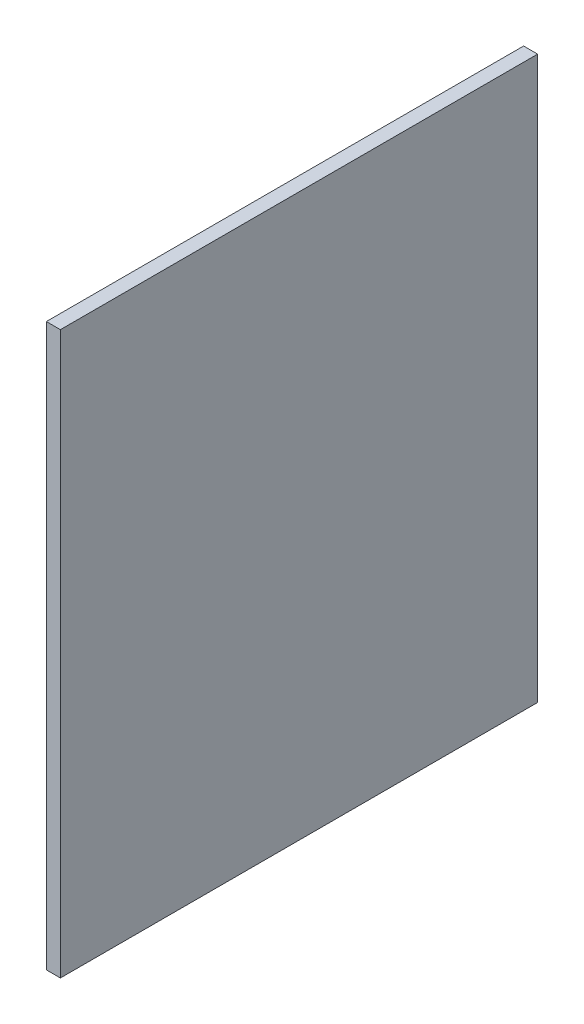
ISO-10303-21;
HEADER;
FILE_DESCRIPTION(('STEP AP214'),'2;1');
FILE_NAME('part.step','',(''),(''),'','','');
FILE_SCHEMA(('AUTOMOTIVE_DESIGN { 1 0 10303 214 1 1 1 1 }'));
ENDSEC;
DATA;
#1=APPLICATION_CONTEXT('core data for automotive mechanical design processes');
#2=APPLICATION_PROTOCOL_DEFINITION('international standard','automotive_design',2000,#1);
#3=PRODUCT_CONTEXT('',#1,'mechanical');
#4=PRODUCT('Part','Part','',(#3));
#5=PRODUCT_RELATED_PRODUCT_CATEGORY('part','',(#4));
#6=PRODUCT_DEFINITION_FORMATION('','',#4);
#7=PRODUCT_DEFINITION_CONTEXT('part definition',#1,'design');
#8=PRODUCT_DEFINITION('design','',#6,#7);
#9=PRODUCT_DEFINITION_SHAPE('','',#8);
#10=(LENGTH_UNIT() NAMED_UNIT(*) SI_UNIT(.MILLI.,.METRE.));
#11=(NAMED_UNIT(*) PLANE_ANGLE_UNIT() SI_UNIT($,.RADIAN.));
#12=(NAMED_UNIT(*) SI_UNIT($,.STERADIAN.) SOLID_ANGLE_UNIT());
#13=UNCERTAINTY_MEASURE_WITH_UNIT(LENGTH_MEASURE(1.E-05),#10,'distance_accuracy_value','');
#14=(GEOMETRIC_REPRESENTATION_CONTEXT(3) GLOBAL_UNCERTAINTY_ASSIGNED_CONTEXT((#13)) GLOBAL_UNIT_ASSIGNED_CONTEXT((#10,
#11,#12)) REPRESENTATION_CONTEXT('',''));
#15=CARTESIAN_POINT('',(0.,0.,0.));
#16=DIRECTION('',(0.,0.,1.));
#17=DIRECTION('',(1.,0.,0.));
#18=AXIS2_PLACEMENT_3D('',#15,#16,#17);
#19=CARTESIAN_POINT('',(5.,-100.,85.));
#20=DIRECTION('',(0.,0.,-1.));
#21=DIRECTION('',(-1.,0.,0.));
#22=AXIS2_PLACEMENT_3D('',#19,#20,#21);
#23=PLANE('',#22);
#24=DIRECTION('',(0.,-1.,0.));
#25=VECTOR('',#24,1.);
#26=CARTESIAN_POINT('',(0.,-100.,85.));
#27=LINE('',#26,#25);
#28=CARTESIAN_POINT('',(0.,100.,85.));
#29=VERTEX_POINT('',#28);
#30=CARTESIAN_POINT('',(0.,-100.,85.));
#31=VERTEX_POINT('',#30);
#32=EDGE_CURVE('E96',#29,#31,#27,.T.);
#33=ORIENTED_EDGE('',*,*,#32,.T.);
#34=DIRECTION('',(-1.,0.,0.));
#35=VECTOR('',#34,1.);
#36=CARTESIAN_POINT('',(5.,-100.,85.));
#37=LINE('',#36,#35);
#38=CARTESIAN_POINT('',(5.,-100.,85.));
#39=VERTEX_POINT('',#38);
#40=EDGE_CURVE('E11',#39,#31,#37,.T.);
#41=ORIENTED_EDGE('',*,*,#40,.F.);
#42=DIRECTION('',(0.,-1.,0.));
#43=VECTOR('',#42,1.);
#44=CARTESIAN_POINT('',(5.,-100.,85.));
#45=LINE('',#44,#43);
#46=CARTESIAN_POINT('',(5.,100.,85.));
#47=VERTEX_POINT('',#46);
#48=EDGE_CURVE('E84',#47,#39,#45,.T.);
#49=ORIENTED_EDGE('',*,*,#48,.F.);
#50=DIRECTION('',(-1.,0.,0.));
#51=VECTOR('',#50,1.);
#52=CARTESIAN_POINT('',(5.,100.,85.));
#53=LINE('',#52,#51);
#54=EDGE_CURVE('E92',#47,#29,#53,.T.);
#55=ORIENTED_EDGE('',*,*,#54,.T.);
#56=EDGE_LOOP('',(#33,#41,#49,#55));
#57=FACE_BOUND('',#56,.T.);
#58=ADVANCED_FACE('F33',(#57),#23,.F.);
#59=CARTESIAN_POINT('',(5.,-100.,-85.));
#60=DIRECTION('',(0.,1.,0.));
#61=DIRECTION('',(0.,0.,1.));
#62=AXIS2_PLACEMENT_3D('',#59,#60,#61);
#63=PLANE('',#62);
#64=DIRECTION('',(0.,0.,-1.));
#65=VECTOR('',#64,1.);
#66=CARTESIAN_POINT('',(0.,-100.,-85.));
#67=LINE('',#66,#65);
#68=CARTESIAN_POINT('',(0.,-100.,-85.));
#69=VERTEX_POINT('',#68);
#70=EDGE_CURVE('E88',#31,#69,#67,.T.);
#71=ORIENTED_EDGE('',*,*,#70,.T.);
#72=DIRECTION('',(-1.,0.,0.));
#73=VECTOR('',#72,1.);
#74=CARTESIAN_POINT('',(5.,-100.,-85.));
#75=LINE('',#74,#73);
#76=CARTESIAN_POINT('',(5.,-100.,-85.));
#77=VERTEX_POINT('',#76);
#78=EDGE_CURVE('E41',#77,#69,#75,.T.);
#79=ORIENTED_EDGE('',*,*,#78,.F.);
#80=DIRECTION('',(0.,0.,-1.));
#81=VECTOR('',#80,1.);
#82=CARTESIAN_POINT('',(5.,-100.,-85.));
#83=LINE('',#82,#81);
#84=EDGE_CURVE('E79',#39,#77,#83,.T.);
#85=ORIENTED_EDGE('',*,*,#84,.F.);
#86=ORIENTED_EDGE('',*,*,#40,.T.);
#87=EDGE_LOOP('',(#71,#79,#85,#86));
#88=FACE_BOUND('',#87,.T.);
#89=ADVANCED_FACE('F87',(#88),#63,.F.);
#90=CARTESIAN_POINT('',(5.,-100.,-85.));
#91=DIRECTION('',(0.,0.,1.));
#92=DIRECTION('',(1.,0.,0.));
#93=AXIS2_PLACEMENT_3D('',#90,#91,#92);
#94=PLANE('',#93);
#95=DIRECTION('',(0.,1.,0.));
#96=VECTOR('',#95,1.);
#97=CARTESIAN_POINT('',(0.,-100.,-85.));
#98=LINE('',#97,#96);
#99=CARTESIAN_POINT('',(0.,100.,-85.));
#100=VERTEX_POINT('',#99);
#101=EDGE_CURVE('E66',#69,#100,#98,.T.);
#102=ORIENTED_EDGE('',*,*,#101,.T.);
#103=DIRECTION('',(-1.,0.,0.));
#104=VECTOR('',#103,1.);
#105=CARTESIAN_POINT('',(5.,100.,-85.));
#106=LINE('',#105,#104);
#107=CARTESIAN_POINT('',(5.,100.,-85.));
#108=VERTEX_POINT('',#107);
#109=EDGE_CURVE('E89',#108,#100,#106,.T.);
#110=ORIENTED_EDGE('',*,*,#109,.F.);
#111=DIRECTION('',(0.,1.,0.));
#112=VECTOR('',#111,1.);
#113=CARTESIAN_POINT('',(5.,-100.,-85.));
#114=LINE('',#113,#112);
#115=EDGE_CURVE('E82',#77,#108,#114,.T.);
#116=ORIENTED_EDGE('',*,*,#115,.F.);
#117=ORIENTED_EDGE('',*,*,#78,.T.);
#118=EDGE_LOOP('',(#102,#110,#116,#117));
#119=FACE_BOUND('',#118,.T.);
#120=ADVANCED_FACE('F90',(#119),#94,.F.);
#121=CARTESIAN_POINT('',(5.,100.,-85.));
#122=DIRECTION('',(0.,-1.,0.));
#123=DIRECTION('',(0.,0.,-1.));
#124=AXIS2_PLACEMENT_3D('',#121,#122,#123);
#125=PLANE('',#124);
#126=DIRECTION('',(0.,0.,1.));
#127=VECTOR('',#126,1.);
#128=CARTESIAN_POINT('',(0.,100.,-85.));
#129=LINE('',#128,#127);
#130=EDGE_CURVE('E72',#100,#29,#129,.T.);
#131=ORIENTED_EDGE('',*,*,#130,.T.);
#132=ORIENTED_EDGE('',*,*,#54,.F.);
#133=DIRECTION('',(0.,0.,1.));
#134=VECTOR('',#133,1.);
#135=CARTESIAN_POINT('',(5.,100.,-85.));
#136=LINE('',#135,#134);
#137=EDGE_CURVE('E49',#108,#47,#136,.T.);
#138=ORIENTED_EDGE('',*,*,#137,.F.);
#139=ORIENTED_EDGE('',*,*,#109,.T.);
#140=EDGE_LOOP('',(#131,#132,#138,#139));
#141=FACE_BOUND('',#140,.T.);
#142=ADVANCED_FACE('F103',(#141),#125,.F.);
#143=CARTESIAN_POINT('',(5.,0.,0.));
#144=DIRECTION('',(1.,0.,0.));
#145=DIRECTION('',(0.,0.,-1.));
#146=AXIS2_PLACEMENT_3D('',#143,#144,#145);
#147=PLANE('',#146);
#148=ORIENTED_EDGE('',*,*,#48,.T.);
#149=ORIENTED_EDGE('',*,*,#84,.T.);
#150=ORIENTED_EDGE('',*,*,#115,.T.);
#151=ORIENTED_EDGE('',*,*,#137,.T.);
#152=EDGE_LOOP('',(#148,#149,#150,#151));
#153=FACE_BOUND('',#152,.T.);
#154=ADVANCED_FACE('F80',(#153),#147,.T.);
#155=CARTESIAN_POINT('',(0.,0.,0.));
#156=DIRECTION('',(1.,0.,0.));
#157=DIRECTION('',(0.,0.,-1.));
#158=AXIS2_PLACEMENT_3D('',#155,#156,#157);
#159=PLANE('',#158);
#160=ORIENTED_EDGE('',*,*,#32,.F.);
#161=ORIENTED_EDGE('',*,*,#130,.F.);
#162=ORIENTED_EDGE('',*,*,#101,.F.);
#163=ORIENTED_EDGE('',*,*,#70,.F.);
#164=EDGE_LOOP('',(#160,#161,#162,#163));
#165=FACE_BOUND('',#164,.T.);
#166=ADVANCED_FACE('F106',(#165),#159,.F.);
#167=CLOSED_SHELL('',(#58,#89,#120,#142,#154,#166));
#168=MANIFOLD_SOLID_BREP('B2',#167);
#169=ADVANCED_BREP_SHAPE_REPRESENTATION('',(#18,#168),#14);
#170=SHAPE_DEFINITION_REPRESENTATION(#9,#169);
ENDSEC;
END-ISO-10303-21;
